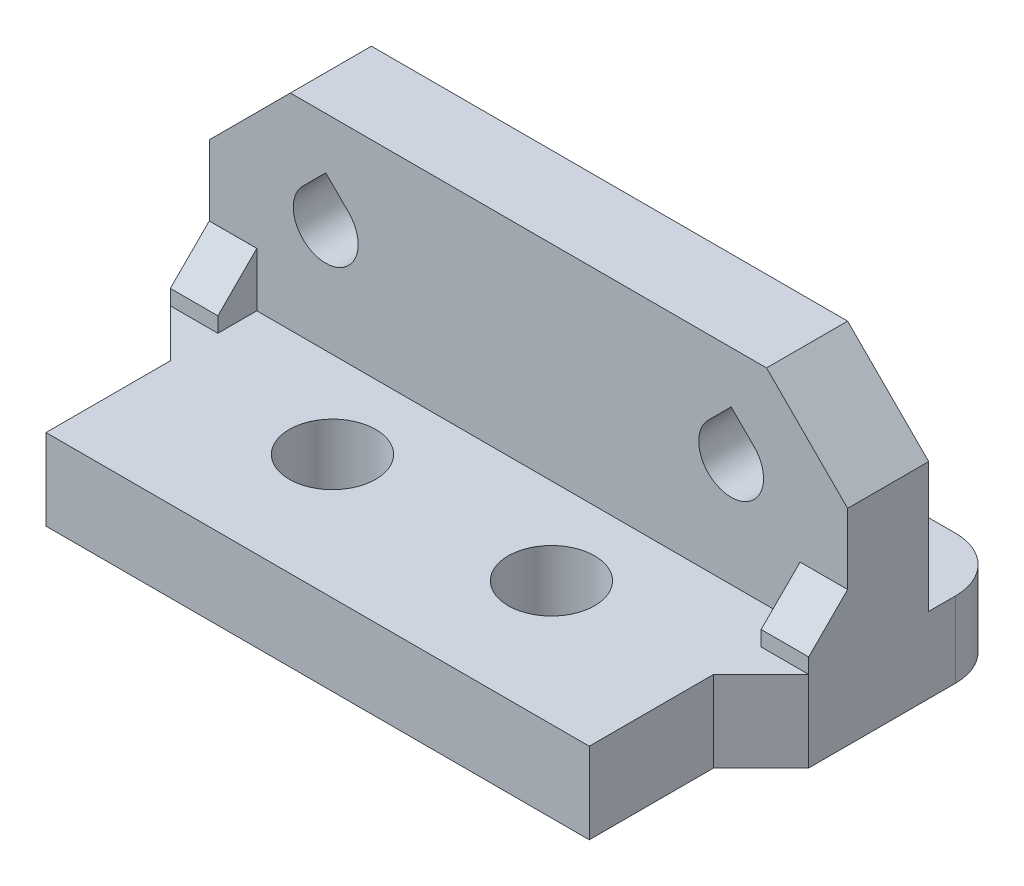
ISO-10303-21;
HEADER;
FILE_DESCRIPTION(('STEP AP214'),'2;1');
FILE_NAME('part.step','',(''),(''),'','','');
FILE_SCHEMA(('AUTOMOTIVE_DESIGN { 1 0 10303 214 1 1 1 1 }'));
ENDSEC;
DATA;
#1=APPLICATION_CONTEXT('core data for automotive mechanical design processes');
#2=APPLICATION_PROTOCOL_DEFINITION('international standard','automotive_design',2000,#1);
#3=PRODUCT_CONTEXT('',#1,'mechanical');
#4=PRODUCT('Part','Part','',(#3));
#5=PRODUCT_RELATED_PRODUCT_CATEGORY('part','',(#4));
#6=PRODUCT_DEFINITION_FORMATION('','',#4);
#7=PRODUCT_DEFINITION_CONTEXT('part definition',#1,'design');
#8=PRODUCT_DEFINITION('design','',#6,#7);
#9=PRODUCT_DEFINITION_SHAPE('','',#8);
#10=(LENGTH_UNIT() NAMED_UNIT(*) SI_UNIT(.MILLI.,.METRE.));
#11=(NAMED_UNIT(*) PLANE_ANGLE_UNIT() SI_UNIT($,.RADIAN.));
#12=(NAMED_UNIT(*) SI_UNIT($,.STERADIAN.) SOLID_ANGLE_UNIT());
#13=UNCERTAINTY_MEASURE_WITH_UNIT(LENGTH_MEASURE(1.E-05),#10,'distance_accuracy_value','');
#14=(GEOMETRIC_REPRESENTATION_CONTEXT(3) GLOBAL_UNCERTAINTY_ASSIGNED_CONTEXT((#13)) GLOBAL_UNIT_ASSIGNED_CONTEXT((#10,
#11,#12)) REPRESENTATION_CONTEXT('',''));
#15=CARTESIAN_POINT('',(0.,0.,0.));
#16=DIRECTION('',(0.,0.,1.));
#17=DIRECTION('',(1.,0.,0.));
#18=AXIS2_PLACEMENT_3D('',#15,#16,#17);
#19=CARTESIAN_POINT('',(0.,3.,0.));
#20=DIRECTION('',(0.,1.,0.));
#21=DIRECTION('',(0.,0.,1.));
#22=AXIS2_PLACEMENT_3D('',#19,#20,#21);
#23=PLANE('',#22);
#24=DIRECTION('',(0.,0.,1.));
#25=VECTOR('',#24,1.);
#26=CARTESIAN_POINT('',(10.05,3.,0.));
#27=LINE('',#26,#25);
#28=CARTESIAN_POINT('',(10.05,3.,-3.2));
#29=VERTEX_POINT('',#28);
#30=CARTESIAN_POINT('',(10.05,3.,-1.75940107675852));
#31=VERTEX_POINT('',#30);
#32=EDGE_CURVE('E280',#29,#31,#27,.T.);
#33=ORIENTED_EDGE('',*,*,#32,.F.);
#34=DIRECTION('',(1.,0.,0.));
#35=VECTOR('',#34,1.);
#36=CARTESIAN_POINT('',(0.,3.,-3.2));
#37=LINE('',#36,#35);
#38=CARTESIAN_POINT('',(-10.05,3.,-3.2));
#39=VERTEX_POINT('',#38);
#40=EDGE_CURVE('E369',#39,#29,#37,.T.);
#41=ORIENTED_EDGE('',*,*,#40,.F.);
#42=DIRECTION('',(0.,0.,1.));
#43=VECTOR('',#42,1.);
#44=CARTESIAN_POINT('',(-10.05,3.,0.));
#45=LINE('',#44,#43);
#46=CARTESIAN_POINT('',(-10.05,3.,-1.75940107675852));
#47=VERTEX_POINT('',#46);
#48=EDGE_CURVE('E300',#39,#47,#45,.T.);
#49=ORIENTED_EDGE('',*,*,#48,.T.);
#50=DIRECTION('',(-1.,0.,0.));
#51=VECTOR('',#50,1.);
#52=CARTESIAN_POINT('',(0.,3.,-1.75940107675852));
#53=LINE('',#52,#51);
#54=CARTESIAN_POINT('',(-11.8094010767585,3.,-1.75940107675852));
#55=VERTEX_POINT('',#54);
#56=EDGE_CURVE('E291',#47,#55,#53,.T.);
#57=ORIENTED_EDGE('',*,*,#56,.T.);
#58=DIRECTION('',(0.707106781186544,0.,0.707106781186551));
#59=VECTOR('',#58,1.);
#60=CARTESIAN_POINT('',(-5.02500000000006,3.,5.025));
#61=LINE('',#60,#59);
#62=CARTESIAN_POINT('',(-10.05,3.,0.));
#63=VERTEX_POINT('',#62);
#64=EDGE_CURVE('E372',#55,#63,#61,.T.);
#65=ORIENTED_EDGE('',*,*,#64,.T.);
#66=DIRECTION('',(0.,0.,-1.));
#67=VECTOR('',#66,1.);
#68=CARTESIAN_POINT('',(-10.05,3.,0.));
#69=LINE('',#68,#67);
#70=CARTESIAN_POINT('',(-10.05,3.,4.6));
#71=VERTEX_POINT('',#70);
#72=EDGE_CURVE('E375',#71,#63,#69,.T.);
#73=ORIENTED_EDGE('',*,*,#72,.F.);
#74=DIRECTION('',(1.,0.,0.));
#75=VECTOR('',#74,1.);
#76=CARTESIAN_POINT('',(0.,3.,4.6));
#77=LINE('',#76,#75);
#78=CARTESIAN_POINT('',(10.05,3.,4.6));
#79=VERTEX_POINT('',#78);
#80=EDGE_CURVE('E378',#71,#79,#77,.T.);
#81=ORIENTED_EDGE('',*,*,#80,.T.);
#82=DIRECTION('',(0.,0.,-1.));
#83=VECTOR('',#82,1.);
#84=CARTESIAN_POINT('',(10.05,3.,0.));
#85=LINE('',#84,#83);
#86=CARTESIAN_POINT('',(10.05,3.,0.));
#87=VERTEX_POINT('',#86);
#88=EDGE_CURVE('E380',#79,#87,#85,.T.);
#89=ORIENTED_EDGE('',*,*,#88,.T.);
#90=DIRECTION('',(-0.707106781186544,0.,0.707106781186551));
#91=VECTOR('',#90,1.);
#92=CARTESIAN_POINT('',(5.02500000000005,3.,5.025));
#93=LINE('',#92,#91);
#94=CARTESIAN_POINT('',(11.8094010767585,3.,-1.75940107675852));
#95=VERTEX_POINT('',#94);
#96=EDGE_CURVE('E382',#95,#87,#93,.T.);
#97=ORIENTED_EDGE('',*,*,#96,.F.);
#98=DIRECTION('',(1.,0.,0.));
#99=VECTOR('',#98,1.);
#100=CARTESIAN_POINT('',(0.,3.,-1.75940107675852));
#101=LINE('',#100,#99);
#102=EDGE_CURVE('E277',#31,#95,#101,.T.);
#103=ORIENTED_EDGE('',*,*,#102,.F.);
#104=EDGE_LOOP('',(#33,#41,#49,#57,#65,#73,#81,#89,#97,#103));
#105=FACE_BOUND('',#104,.T.);
#106=CARTESIAN_POINT('',(-4.05,3.,0.));
#107=DIRECTION('',(0.,1.,0.));
#108=DIRECTION('',(0.,0.,1.));
#109=AXIS2_PLACEMENT_3D('',#106,#107,#108);
#110=CIRCLE('',#109,1.6);
#111=CARTESIAN_POINT('',(-4.05,3.,1.6));
#112=VERTEX_POINT('',#111);
#113=EDGE_CURVE('E363',#112,#112,#110,.T.);
#114=ORIENTED_EDGE('',*,*,#113,.F.);
#115=EDGE_LOOP('',(#114));
#116=FACE_BOUND('',#115,.T.);
#117=CARTESIAN_POINT('',(4.05,3.,0.));
#118=DIRECTION('',(0.,1.,0.));
#119=DIRECTION('',(0.,0.,1.));
#120=AXIS2_PLACEMENT_3D('',#117,#118,#119);
#121=CIRCLE('',#120,1.6);
#122=CARTESIAN_POINT('',(4.05,3.,1.6));
#123=VERTEX_POINT('',#122);
#124=EDGE_CURVE('E357',#123,#123,#121,.T.);
#125=ORIENTED_EDGE('',*,*,#124,.F.);
#126=EDGE_LOOP('',(#125));
#127=FACE_BOUND('',#126,.T.);
#128=ADVANCED_FACE('F43',(#105,#116,#127),#23,.T.);
#129=CARTESIAN_POINT('',(0.,3.,-6.2));
#130=DIRECTION('',(0.,0.,-1.));
#131=DIRECTION('',(-1.,0.,0.));
#132=AXIS2_PLACEMENT_3D('',#129,#130,#131);
#133=PLANE('',#132);
#134=DIRECTION('',(1.,0.,0.));
#135=VECTOR('',#134,1.);
#136=CARTESIAN_POINT('',(0.,2.8,-6.2));
#137=LINE('',#136,#135);
#138=CARTESIAN_POINT('',(-11.8094010767585,2.8,-6.2));
#139=VERTEX_POINT('',#138);
#140=CARTESIAN_POINT('',(11.8094010767585,2.8,-6.2));
#141=VERTEX_POINT('',#140);
#142=EDGE_CURVE('E242',#139,#141,#137,.T.);
#143=ORIENTED_EDGE('',*,*,#142,.F.);
#144=DIRECTION('',(0.,-1.,0.));
#145=VECTOR('',#144,1.);
#146=CARTESIAN_POINT('',(-11.8094010767585,42.0085660040033,-6.2));
#147=LINE('',#146,#145);
#148=CARTESIAN_POINT('',(-11.8094010767585,7.6,-6.2));
#149=VERTEX_POINT('',#148);
#150=EDGE_CURVE('E247',#149,#139,#147,.T.);
#151=ORIENTED_EDGE('',*,*,#150,.F.);
#152=DIRECTION('',(-0.707106781186549,-0.707106781186546,0.));
#153=VECTOR('',#152,1.);
#154=CARTESIAN_POINT('',(-8.20470053837923,11.2047005383793,-6.2));
#155=LINE('',#154,#153);
#156=CARTESIAN_POINT('',(-8.8094010767585,10.6,-6.2));
#157=VERTEX_POINT('',#156);
#158=EDGE_CURVE('E438',#149,#157,#155,.F.);
#159=ORIENTED_EDGE('',*,*,#158,.T.);
#160=DIRECTION('',(1.,0.,0.));
#161=VECTOR('',#160,1.);
#162=CARTESIAN_POINT('',(0.,10.6,-6.2));
#163=LINE('',#162,#161);
#164=CARTESIAN_POINT('',(8.8094010767585,10.6,-6.2));
#165=VERTEX_POINT('',#164);
#166=EDGE_CURVE('E248',#157,#165,#163,.T.);
#167=ORIENTED_EDGE('',*,*,#166,.T.);
#168=DIRECTION('',(0.707106781186546,-0.707106781186549,0.));
#169=VECTOR('',#168,1.);
#170=CARTESIAN_POINT('',(8.20470053837927,11.2047005383792,-6.2));
#171=LINE('',#170,#169);
#172=CARTESIAN_POINT('',(11.8094010767585,7.59999999999999,-6.2));
#173=VERTEX_POINT('',#172);
#174=EDGE_CURVE('E245',#165,#173,#171,.T.);
#175=ORIENTED_EDGE('',*,*,#174,.T.);
#176=DIRECTION('',(0.,-1.,0.));
#177=VECTOR('',#176,1.);
#178=CARTESIAN_POINT('',(11.8094010767585,42.0085660040033,-6.2));
#179=LINE('',#178,#177);
#180=EDGE_CURVE('E237',#173,#141,#179,.T.);
#181=ORIENTED_EDGE('',*,*,#180,.T.);
#182=EDGE_LOOP('',(#143,#151,#159,#167,#175,#181));
#183=FACE_BOUND('',#182,.T.);
#184=DIRECTION('',(0.707106781186542,-0.707106781186553,0.));
#185=VECTOR('',#184,1.);
#186=CARTESIAN_POINT('',(0.598528137423805,0.598528137423795,-6.2));
#187=LINE('',#186,#185);
#188=CARTESIAN_POINT('',(-7.5,8.69705627484773,-6.2));
#189=VERTEX_POINT('',#188);
#190=CARTESIAN_POINT('',(-6.65147186257614,7.84852813742386,-6.2));
#191=VERTEX_POINT('',#190);
#192=EDGE_CURVE('E336',#189,#191,#187,.T.);
#193=ORIENTED_EDGE('',*,*,#192,.F.);
#194=DIRECTION('',(-0.707106781186542,-0.707106781186553,0.));
#195=VECTOR('',#194,1.);
#196=CARTESIAN_POINT('',(-8.09852813742393,8.09852813742379,-6.2));
#197=LINE('',#196,#195);
#198=CARTESIAN_POINT('',(-8.34852813742386,7.84852813742385,-6.2));
#199=VERTEX_POINT('',#198);
#200=EDGE_CURVE('E333',#189,#199,#197,.T.);
#201=ORIENTED_EDGE('',*,*,#200,.T.);
#202=CARTESIAN_POINT('',(-7.5,7.,-6.2));
#203=DIRECTION('',(0.,0.,-1.));
#204=DIRECTION('',(-1.,0.,0.));
#205=AXIS2_PLACEMENT_3D('',#202,#203,#204);
#206=CIRCLE('',#205,1.2);
#207=EDGE_CURVE('E303',#191,#199,#206,.T.);
#208=ORIENTED_EDGE('',*,*,#207,.F.);
#209=EDGE_LOOP('',(#193,#201,#208));
#210=FACE_BOUND('',#209,.T.);
#211=DIRECTION('',(0.707106781186543,-0.707106781186552,0.));
#212=VECTOR('',#211,1.);
#213=CARTESIAN_POINT('',(8.09852813742391,8.09852813742381,-6.2));
#214=LINE('',#213,#212);
#215=CARTESIAN_POINT('',(7.5,8.69705627484772,-6.2));
#216=VERTEX_POINT('',#215);
#217=CARTESIAN_POINT('',(8.34852813742386,7.84852813742385,-6.2));
#218=VERTEX_POINT('',#217);
#219=EDGE_CURVE('E316',#216,#218,#214,.T.);
#220=ORIENTED_EDGE('',*,*,#219,.F.);
#221=DIRECTION('',(-0.707106781186544,-0.707106781186551,0.));
#222=VECTOR('',#221,1.);
#223=CARTESIAN_POINT('',(-0.598528137423822,0.598528137423816,-6.2));
#224=LINE('',#223,#222);
#225=CARTESIAN_POINT('',(6.65147186257613,7.84852813742385,-6.2));
#226=VERTEX_POINT('',#225);
#227=EDGE_CURVE('E312',#216,#226,#224,.T.);
#228=ORIENTED_EDGE('',*,*,#227,.T.);
#229=CARTESIAN_POINT('',(7.5,7.,-6.2));
#230=DIRECTION('',(0.,0.,-1.));
#231=DIRECTION('',(-1.,0.,0.));
#232=AXIS2_PLACEMENT_3D('',#229,#230,#231);
#233=CIRCLE('',#232,1.2);
#234=EDGE_CURVE('E309',#218,#226,#233,.T.);
#235=ORIENTED_EDGE('',*,*,#234,.F.);
#236=EDGE_LOOP('',(#220,#228,#235));
#237=FACE_BOUND('',#236,.T.);
#238=ADVANCED_FACE('F239',(#183,#210,#237),#133,.T.);
#239=CARTESIAN_POINT('',(0.,42.0085660040033,-3.2));
#240=DIRECTION('',(0.,0.,-1.));
#241=DIRECTION('',(-1.,0.,0.));
#242=AXIS2_PLACEMENT_3D('',#239,#240,#241);
#243=PLANE('',#242);
#244=DIRECTION('',(0.707106781186542,0.707106781186553,0.));
#245=VECTOR('',#244,1.);
#246=CARTESIAN_POINT('',(-8.09852813742393,8.09852813742379,-3.2));
#247=LINE('',#246,#245);
#248=CARTESIAN_POINT('',(-8.34852813742386,7.84852813742386,-3.2));
#249=VERTEX_POINT('',#248);
#250=CARTESIAN_POINT('',(-7.5,8.69705627484773,-3.2));
#251=VERTEX_POINT('',#250);
#252=EDGE_CURVE('E329',#249,#251,#247,.T.);
#253=ORIENTED_EDGE('',*,*,#252,.T.);
#254=DIRECTION('',(-0.707106781186542,0.707106781186553,0.));
#255=VECTOR('',#254,1.);
#256=CARTESIAN_POINT('',(0.598528137423805,0.598528137423795,-3.2));
#257=LINE('',#256,#255);
#258=CARTESIAN_POINT('',(-6.65147186257614,7.84852813742385,-3.2));
#259=VERTEX_POINT('',#258);
#260=EDGE_CURVE('E327',#259,#251,#257,.T.);
#261=ORIENTED_EDGE('',*,*,#260,.F.);
#262=CARTESIAN_POINT('',(-7.5,7.,-3.2));
#263=DIRECTION('',(0.,0.,-1.));
#264=DIRECTION('',(-1.,0.,0.));
#265=AXIS2_PLACEMENT_3D('',#262,#263,#264);
#266=CIRCLE('',#265,1.2);
#267=EDGE_CURVE('E313',#249,#259,#266,.F.);
#268=ORIENTED_EDGE('',*,*,#267,.F.);
#269=EDGE_LOOP('',(#253,#261,#268));
#270=FACE_BOUND('',#269,.T.);
#271=DIRECTION('',(0.,-1.,0.));
#272=VECTOR('',#271,1.);
#273=CARTESIAN_POINT('',(11.8094010767585,42.0085660040033,-3.2));
#274=LINE('',#273,#272);
#275=CARTESIAN_POINT('',(11.8094010767585,7.59999999999999,-3.2));
#276=VERTEX_POINT('',#275);
#277=CARTESIAN_POINT('',(11.8094010767585,5.,-3.2));
#278=VERTEX_POINT('',#277);
#279=EDGE_CURVE('E351',#276,#278,#274,.T.);
#280=ORIENTED_EDGE('',*,*,#279,.F.);
#281=DIRECTION('',(-0.707106781186546,0.707106781186549,0.));
#282=VECTOR('',#281,1.);
#283=CARTESIAN_POINT('',(8.8094010767585,10.6,-3.2));
#284=LINE('',#283,#282);
#285=CARTESIAN_POINT('',(8.8094010767585,10.6,-3.2));
#286=VERTEX_POINT('',#285);
#287=EDGE_CURVE('E445',#276,#286,#284,.T.);
#288=ORIENTED_EDGE('',*,*,#287,.T.);
#289=DIRECTION('',(1.,0.,0.));
#290=VECTOR('',#289,1.);
#291=CARTESIAN_POINT('',(0.,10.6,-3.2));
#292=LINE('',#291,#290);
#293=CARTESIAN_POINT('',(-8.8094010767585,10.6,-3.2));
#294=VERTEX_POINT('',#293);
#295=EDGE_CURVE('E347',#294,#286,#292,.T.);
#296=ORIENTED_EDGE('',*,*,#295,.F.);
#297=DIRECTION('',(0.707106781186549,0.707106781186546,0.));
#298=VECTOR('',#297,1.);
#299=CARTESIAN_POINT('',(-11.8094010767585,7.6,-3.2));
#300=LINE('',#299,#298);
#301=CARTESIAN_POINT('',(-11.8094010767585,7.6,-3.2));
#302=VERTEX_POINT('',#301);
#303=EDGE_CURVE('E443',#294,#302,#300,.F.);
#304=ORIENTED_EDGE('',*,*,#303,.T.);
#305=DIRECTION('',(0.,-1.,0.));
#306=VECTOR('',#305,1.);
#307=CARTESIAN_POINT('',(-11.8094010767585,42.0085660040033,-3.2));
#308=LINE('',#307,#306);
#309=CARTESIAN_POINT('',(-11.8094010767585,5.,-3.2));
#310=VERTEX_POINT('',#309);
#311=EDGE_CURVE('E354',#302,#310,#308,.T.);
#312=ORIENTED_EDGE('',*,*,#311,.T.);
#313=DIRECTION('',(1.,0.,0.));
#314=VECTOR('',#313,1.);
#315=CARTESIAN_POINT('',(0.,5.,-3.2));
#316=LINE('',#315,#314);
#317=CARTESIAN_POINT('',(-10.05,5.,-3.2));
#318=VERTEX_POINT('',#317);
#319=EDGE_CURVE('E284',#310,#318,#316,.T.);
#320=ORIENTED_EDGE('',*,*,#319,.T.);
#321=DIRECTION('',(0.,-1.,0.));
#322=VECTOR('',#321,1.);
#323=CARTESIAN_POINT('',(-10.05,9.27394314056959,-3.2));
#324=LINE('',#323,#322);
#325=EDGE_CURVE('E287',#318,#39,#324,.T.);
#326=ORIENTED_EDGE('',*,*,#325,.T.);
#327=ORIENTED_EDGE('',*,*,#40,.T.);
#328=DIRECTION('',(0.,-1.,0.));
#329=VECTOR('',#328,1.);
#330=CARTESIAN_POINT('',(10.05,9.27394314056959,-3.2));
#331=LINE('',#330,#329);
#332=CARTESIAN_POINT('',(10.05,5.,-3.2));
#333=VERTEX_POINT('',#332);
#334=EDGE_CURVE('E267',#333,#29,#331,.T.);
#335=ORIENTED_EDGE('',*,*,#334,.F.);
#336=DIRECTION('',(1.,0.,0.));
#337=VECTOR('',#336,1.);
#338=CARTESIAN_POINT('',(0.,5.,-3.2));
#339=LINE('',#338,#337);
#340=EDGE_CURVE('E269',#333,#278,#339,.T.);
#341=ORIENTED_EDGE('',*,*,#340,.T.);
#342=EDGE_LOOP('',(#280,#288,#296,#304,#312,#320,#326,#327,#335,#341));
#343=FACE_BOUND('',#342,.T.);
#344=DIRECTION('',(0.707106781186544,0.707106781186551,0.));
#345=VECTOR('',#344,1.);
#346=CARTESIAN_POINT('',(-0.598528137423822,0.598528137423816,-3.2));
#347=LINE('',#346,#345);
#348=CARTESIAN_POINT('',(6.65147186257613,7.84852813742385,-3.2));
#349=VERTEX_POINT('',#348);
#350=CARTESIAN_POINT('',(7.5,8.69705627484772,-3.2));
#351=VERTEX_POINT('',#350);
#352=EDGE_CURVE('E307',#349,#351,#347,.T.);
#353=ORIENTED_EDGE('',*,*,#352,.T.);
#354=DIRECTION('',(-0.707106781186543,0.707106781186552,0.));
#355=VECTOR('',#354,1.);
#356=CARTESIAN_POINT('',(8.09852813742391,8.09852813742381,-3.2));
#357=LINE('',#356,#355);
#358=CARTESIAN_POINT('',(8.34852813742386,7.84852813742385,-3.2));
#359=VERTEX_POINT('',#358);
#360=EDGE_CURVE('E304',#359,#351,#357,.T.);
#361=ORIENTED_EDGE('',*,*,#360,.F.);
#362=CARTESIAN_POINT('',(7.5,7.,-3.2));
#363=DIRECTION('',(0.,0.,-1.));
#364=DIRECTION('',(-1.,0.,0.));
#365=AXIS2_PLACEMENT_3D('',#362,#363,#364);
#366=CIRCLE('',#365,1.2);
#367=EDGE_CURVE('E306',#349,#359,#366,.F.);
#368=ORIENTED_EDGE('',*,*,#367,.F.);
#369=EDGE_LOOP('',(#353,#361,#368));
#370=FACE_BOUND('',#369,.T.);
#371=ADVANCED_FACE('F517',(#270,#343,#370),#243,.F.);
#372=CARTESIAN_POINT('',(-11.8094010767585,3.,0.));
#373=DIRECTION('',(-1.,0.,0.));
#374=DIRECTION('',(0.,0.,1.));
#375=AXIS2_PLACEMENT_3D('',#372,#373,#374);
#376=PLANE('',#375);
#377=DIRECTION('',(0.,0.,-1.));
#378=VECTOR('',#377,1.);
#379=CARTESIAN_POINT('',(-11.8094010767585,2.8,0.));
#380=LINE('',#379,#378);
#381=CARTESIAN_POINT('',(-11.8094010767585,2.8,-7.2));
#382=VERTEX_POINT('',#381);
#383=EDGE_CURVE('E253',#139,#382,#380,.T.);
#384=ORIENTED_EDGE('',*,*,#383,.T.);
#385=DIRECTION('',(0.,-1.,0.));
#386=VECTOR('',#385,1.);
#387=CARTESIAN_POINT('',(-11.8094010767585,3.,-7.2));
#388=LINE('',#387,#386);
#389=CARTESIAN_POINT('',(-11.8094010767585,0.,-7.2));
#390=VERTEX_POINT('',#389);
#391=EDGE_CURVE('E12',#382,#390,#388,.T.);
#392=ORIENTED_EDGE('',*,*,#391,.T.);
#393=DIRECTION('',(0.,0.,-1.));
#394=VECTOR('',#393,1.);
#395=CARTESIAN_POINT('',(-11.8094010767585,0.,0.));
#396=LINE('',#395,#394);
#397=CARTESIAN_POINT('',(-11.8094010767585,0.,-1.75940107675852));
#398=VERTEX_POINT('',#397);
#399=EDGE_CURVE('E366',#398,#390,#396,.T.);
#400=ORIENTED_EDGE('',*,*,#399,.F.);
#401=DIRECTION('',(0.,-1.,0.));
#402=VECTOR('',#401,1.);
#403=CARTESIAN_POINT('',(-11.8094010767585,3.,-1.75940107675852));
#404=LINE('',#403,#402);
#405=EDGE_CURVE('E413',#55,#398,#404,.T.);
#406=ORIENTED_EDGE('',*,*,#405,.F.);
#407=DIRECTION('',(0.,-1.,0.));
#408=VECTOR('',#407,1.);
#409=CARTESIAN_POINT('',(-11.8094010767585,9.27394314056959,-1.75940107675852));
#410=LINE('',#409,#408);
#411=CARTESIAN_POINT('',(-11.8094010767585,3.55999999999999,-1.75940107675852));
#412=VERTEX_POINT('',#411);
#413=EDGE_CURVE('E292',#412,#55,#410,.T.);
#414=ORIENTED_EDGE('',*,*,#413,.F.);
#415=DIRECTION('',(0.,0.707106781186549,-0.707106781186546));
#416=VECTOR('',#415,1.);
#417=CARTESIAN_POINT('',(-11.8094010767585,2.40029946162073,-0.59970053837927));
#418=LINE('',#417,#416);
#419=CARTESIAN_POINT('',(-11.8094010767585,5.,-3.19940107675853));
#420=VERTEX_POINT('',#419);
#421=EDGE_CURVE('E431',#412,#420,#418,.T.);
#422=ORIENTED_EDGE('',*,*,#421,.T.);
#423=DIRECTION('',(0.,0.,-1.));
#424=VECTOR('',#423,1.);
#425=CARTESIAN_POINT('',(-11.8094010767585,5.,0.));
#426=LINE('',#425,#424);
#427=EDGE_CURVE('E288',#420,#310,#426,.T.);
#428=ORIENTED_EDGE('',*,*,#427,.T.);
#429=ORIENTED_EDGE('',*,*,#311,.F.);
#430=DIRECTION('',(0.,0.,-1.));
#431=VECTOR('',#430,1.);
#432=CARTESIAN_POINT('',(-11.8094010767585,7.6,0.));
#433=LINE('',#432,#431);
#434=EDGE_CURVE('E447',#302,#149,#433,.T.);
#435=ORIENTED_EDGE('',*,*,#434,.T.);
#436=ORIENTED_EDGE('',*,*,#150,.T.);
#437=EDGE_LOOP('',(#384,#392,#400,#406,#414,#422,#428,#429,#435,#436));
#438=FACE_BOUND('',#437,.T.);
#439=ADVANCED_FACE('F504',(#438),#376,.T.);
#440=CARTESIAN_POINT('',(-5.02500000000006,3.,5.025));
#441=DIRECTION('',(0.707106781186551,0.,-0.707106781186544));
#442=DIRECTION('',(-0.707106781186544,0.,-0.707106781186551));
#443=AXIS2_PLACEMENT_3D('',#440,#441,#442);
#444=PLANE('',#443);
#445=DIRECTION('',(0.707106781186544,0.,0.707106781186551));
#446=VECTOR('',#445,1.);
#447=CARTESIAN_POINT('',(-5.02500000000006,0.,5.025));
#448=LINE('',#447,#446);
#449=CARTESIAN_POINT('',(-10.05,0.,0.));
#450=VERTEX_POINT('',#449);
#451=EDGE_CURVE('E388',#398,#450,#448,.T.);
#452=ORIENTED_EDGE('',*,*,#451,.T.);
#453=DIRECTION('',(0.,-1.,0.));
#454=VECTOR('',#453,1.);
#455=CARTESIAN_POINT('',(-10.05,3.,0.));
#456=LINE('',#455,#454);
#457=EDGE_CURVE('E411',#63,#450,#456,.T.);
#458=ORIENTED_EDGE('',*,*,#457,.F.);
#459=ORIENTED_EDGE('',*,*,#64,.F.);
#460=ORIENTED_EDGE('',*,*,#405,.T.);
#461=EDGE_LOOP('',(#452,#458,#459,#460));
#462=FACE_BOUND('',#461,.T.);
#463=ADVANCED_FACE('F500',(#462),#444,.F.);
#464=CARTESIAN_POINT('',(-10.05,3.,0.));
#465=DIRECTION('',(-1.,0.,0.));
#466=DIRECTION('',(0.,0.,1.));
#467=AXIS2_PLACEMENT_3D('',#464,#465,#466);
#468=PLANE('',#467);
#469=DIRECTION('',(0.,0.,-1.));
#470=VECTOR('',#469,1.);
#471=CARTESIAN_POINT('',(-10.05,0.,0.));
#472=LINE('',#471,#470);
#473=CARTESIAN_POINT('',(-10.05,0.,4.6));
#474=VERTEX_POINT('',#473);
#475=EDGE_CURVE('E391',#474,#450,#472,.T.);
#476=ORIENTED_EDGE('',*,*,#475,.F.);
#477=DIRECTION('',(0.,-1.,0.));
#478=VECTOR('',#477,1.);
#479=CARTESIAN_POINT('',(-10.05,3.,4.6));
#480=LINE('',#479,#478);
#481=EDGE_CURVE('E409',#71,#474,#480,.T.);
#482=ORIENTED_EDGE('',*,*,#481,.F.);
#483=ORIENTED_EDGE('',*,*,#72,.T.);
#484=ORIENTED_EDGE('',*,*,#457,.T.);
#485=EDGE_LOOP('',(#476,#482,#483,#484));
#486=FACE_BOUND('',#485,.T.);
#487=ADVANCED_FACE('F496',(#486),#468,.T.);
#488=CARTESIAN_POINT('',(0.,3.,4.6));
#489=DIRECTION('',(0.,0.,-1.));
#490=DIRECTION('',(-1.,0.,0.));
#491=AXIS2_PLACEMENT_3D('',#488,#489,#490);
#492=PLANE('',#491);
#493=DIRECTION('',(1.,0.,0.));
#494=VECTOR('',#493,1.);
#495=CARTESIAN_POINT('',(0.,0.,4.6));
#496=LINE('',#495,#494);
#497=CARTESIAN_POINT('',(10.05,0.,4.6));
#498=VERTEX_POINT('',#497);
#499=EDGE_CURVE('E394',#474,#498,#496,.T.);
#500=ORIENTED_EDGE('',*,*,#499,.T.);
#501=DIRECTION('',(0.,-1.,0.));
#502=VECTOR('',#501,1.);
#503=CARTESIAN_POINT('',(10.05,3.,4.6));
#504=LINE('',#503,#502);
#505=EDGE_CURVE('E406',#79,#498,#504,.T.);
#506=ORIENTED_EDGE('',*,*,#505,.F.);
#507=ORIENTED_EDGE('',*,*,#80,.F.);
#508=ORIENTED_EDGE('',*,*,#481,.T.);
#509=EDGE_LOOP('',(#500,#506,#507,#508));
#510=FACE_BOUND('',#509,.T.);
#511=ADVANCED_FACE('F531',(#510),#492,.F.);
#512=CARTESIAN_POINT('',(10.05,3.,0.));
#513=DIRECTION('',(-1.,0.,0.));
#514=DIRECTION('',(0.,0.,1.));
#515=AXIS2_PLACEMENT_3D('',#512,#513,#514);
#516=PLANE('',#515);
#517=DIRECTION('',(0.,0.,-1.));
#518=VECTOR('',#517,1.);
#519=CARTESIAN_POINT('',(10.05,0.,0.));
#520=LINE('',#519,#518);
#521=CARTESIAN_POINT('',(10.05,0.,0.));
#522=VERTEX_POINT('',#521);
#523=EDGE_CURVE('E396',#498,#522,#520,.T.);
#524=ORIENTED_EDGE('',*,*,#523,.T.);
#525=DIRECTION('',(0.,-1.,0.));
#526=VECTOR('',#525,1.);
#527=CARTESIAN_POINT('',(10.05,3.,0.));
#528=LINE('',#527,#526);
#529=EDGE_CURVE('E404',#87,#522,#528,.T.);
#530=ORIENTED_EDGE('',*,*,#529,.F.);
#531=ORIENTED_EDGE('',*,*,#88,.F.);
#532=ORIENTED_EDGE('',*,*,#505,.T.);
#533=EDGE_LOOP('',(#524,#530,#531,#532));
#534=FACE_BOUND('',#533,.T.);
#535=ADVANCED_FACE('F489',(#534),#516,.F.);
#536=CARTESIAN_POINT('',(5.02500000000005,3.,5.025));
#537=DIRECTION('',(0.707106781186551,0.,0.707106781186544));
#538=DIRECTION('',(0.707106781186544,0.,-0.707106781186551));
#539=AXIS2_PLACEMENT_3D('',#536,#537,#538);
#540=PLANE('',#539);
#541=DIRECTION('',(-0.707106781186544,0.,0.707106781186551));
#542=VECTOR('',#541,1.);
#543=CARTESIAN_POINT('',(5.02500000000005,0.,5.025));
#544=LINE('',#543,#542);
#545=CARTESIAN_POINT('',(11.8094010767585,0.,-1.75940107675852));
#546=VERTEX_POINT('',#545);
#547=EDGE_CURVE('E399',#546,#522,#544,.T.);
#548=ORIENTED_EDGE('',*,*,#547,.F.);
#549=DIRECTION('',(0.,-1.,0.));
#550=VECTOR('',#549,1.);
#551=CARTESIAN_POINT('',(11.8094010767585,3.,-1.75940107675852));
#552=LINE('',#551,#550);
#553=EDGE_CURVE('E385',#95,#546,#552,.T.);
#554=ORIENTED_EDGE('',*,*,#553,.F.);
#555=ORIENTED_EDGE('',*,*,#96,.T.);
#556=ORIENTED_EDGE('',*,*,#529,.T.);
#557=EDGE_LOOP('',(#548,#554,#555,#556));
#558=FACE_BOUND('',#557,.T.);
#559=ADVANCED_FACE('F478',(#558),#540,.T.);
#560=CARTESIAN_POINT('',(11.8094010767585,3.,0.));
#561=DIRECTION('',(-1.,0.,0.));
#562=DIRECTION('',(0.,0.,1.));
#563=AXIS2_PLACEMENT_3D('',#560,#561,#562);
#564=PLANE('',#563);
#565=DIRECTION('',(0.,0.,-1.));
#566=VECTOR('',#565,1.);
#567=CARTESIAN_POINT('',(11.8094010767585,0.,0.));
#568=LINE('',#567,#566);
#569=CARTESIAN_POINT('',(11.8094010767585,0.,-7.2));
#570=VERTEX_POINT('',#569);
#571=EDGE_CURVE('E373',#546,#570,#568,.T.);
#572=ORIENTED_EDGE('',*,*,#571,.T.);
#573=DIRECTION('',(0.,-1.,0.));
#574=VECTOR('',#573,1.);
#575=CARTESIAN_POINT('',(11.8094010767585,2.8,-7.2));
#576=LINE('',#575,#574);
#577=CARTESIAN_POINT('',(11.8094010767585,2.8,-7.2));
#578=VERTEX_POINT('',#577);
#579=EDGE_CURVE('E66',#570,#578,#576,.F.);
#580=ORIENTED_EDGE('',*,*,#579,.T.);
#581=DIRECTION('',(0.,0.,-1.));
#582=VECTOR('',#581,1.);
#583=CARTESIAN_POINT('',(11.8094010767585,2.8,0.));
#584=LINE('',#583,#582);
#585=EDGE_CURVE('E251',#141,#578,#584,.T.);
#586=ORIENTED_EDGE('',*,*,#585,.F.);
#587=ORIENTED_EDGE('',*,*,#180,.F.);
#588=DIRECTION('',(0.,0.,1.));
#589=VECTOR('',#588,1.);
#590=CARTESIAN_POINT('',(11.8094010767585,7.59999999999999,-3.2));
#591=LINE('',#590,#589);
#592=EDGE_CURVE('E441',#173,#276,#591,.T.);
#593=ORIENTED_EDGE('',*,*,#592,.T.);
#594=ORIENTED_EDGE('',*,*,#279,.T.);
#595=DIRECTION('',(0.,0.,-1.));
#596=VECTOR('',#595,1.);
#597=CARTESIAN_POINT('',(11.8094010767585,5.,0.));
#598=LINE('',#597,#596);
#599=CARTESIAN_POINT('',(11.8094010767585,5.,-3.19940107675853));
#600=VERTEX_POINT('',#599);
#601=EDGE_CURVE('E256',#600,#278,#598,.T.);
#602=ORIENTED_EDGE('',*,*,#601,.F.);
#603=DIRECTION('',(0.,0.707106781186546,-0.707106781186549));
#604=VECTOR('',#603,1.);
#605=CARTESIAN_POINT('',(11.8094010767585,3.56,-1.75940107675852));
#606=LINE('',#605,#604);
#607=CARTESIAN_POINT('',(11.8094010767585,3.56,-1.75940107675852));
#608=VERTEX_POINT('',#607);
#609=EDGE_CURVE('E422',#600,#608,#606,.F.);
#610=ORIENTED_EDGE('',*,*,#609,.T.);
#611=DIRECTION('',(0.,-1.,0.));
#612=VECTOR('',#611,1.);
#613=CARTESIAN_POINT('',(11.8094010767585,9.27394314056959,-1.75940107675852));
#614=LINE('',#613,#612);
#615=EDGE_CURVE('E272',#608,#95,#614,.T.);
#616=ORIENTED_EDGE('',*,*,#615,.T.);
#617=ORIENTED_EDGE('',*,*,#553,.T.);
#618=EDGE_LOOP('',(#572,#580,#586,#587,#593,#594,#602,#610,#616,#617));
#619=FACE_BOUND('',#618,.T.);
#620=ADVANCED_FACE('F255',(#619),#564,.F.);
#621=CARTESIAN_POINT('',(0.,0.,0.));
#622=DIRECTION('',(0.,1.,0.));
#623=DIRECTION('',(0.,0.,1.));
#624=AXIS2_PLACEMENT_3D('',#621,#622,#623);
#625=PLANE('',#624);
#626=DIRECTION('',(1.,0.,0.));
#627=VECTOR('',#626,1.);
#628=CARTESIAN_POINT('',(0.,0.,-9.2));
#629=LINE('',#628,#627);
#630=CARTESIAN_POINT('',(-9.8094010767585,0.,-9.2));
#631=VERTEX_POINT('',#630);
#632=CARTESIAN_POINT('',(9.8094010767585,0.,-9.2));
#633=VERTEX_POINT('',#632);
#634=EDGE_CURVE('E263',#631,#633,#629,.T.);
#635=ORIENTED_EDGE('',*,*,#634,.T.);
#636=CARTESIAN_POINT('',(9.8094010767585,0.,-7.2));
#637=DIRECTION('',(0.,1.,0.));
#638=DIRECTION('',(0.,0.,1.));
#639=AXIS2_PLACEMENT_3D('',#636,#637,#638);
#640=CIRCLE('',#639,2.);
#641=EDGE_CURVE('E457',#633,#570,#640,.F.);
#642=ORIENTED_EDGE('',*,*,#641,.T.);
#643=ORIENTED_EDGE('',*,*,#571,.F.);
#644=ORIENTED_EDGE('',*,*,#547,.T.);
#645=ORIENTED_EDGE('',*,*,#523,.F.);
#646=ORIENTED_EDGE('',*,*,#499,.F.);
#647=ORIENTED_EDGE('',*,*,#475,.T.);
#648=ORIENTED_EDGE('',*,*,#451,.F.);
#649=ORIENTED_EDGE('',*,*,#399,.T.);
#650=CARTESIAN_POINT('',(-9.8094010767585,0.,-7.2));
#651=DIRECTION('',(0.,1.,0.));
#652=DIRECTION('',(0.,0.,1.));
#653=AXIS2_PLACEMENT_3D('',#650,#651,#652);
#654=CIRCLE('',#653,2.);
#655=EDGE_CURVE('E455',#390,#631,#654,.F.);
#656=ORIENTED_EDGE('',*,*,#655,.T.);
#657=EDGE_LOOP('',(#635,#642,#643,#644,#645,#646,#647,#648,#649,#656));
#658=FACE_BOUND('',#657,.T.);
#659=CARTESIAN_POINT('',(4.05,0.,0.));
#660=DIRECTION('',(0.,1.,0.));
#661=DIRECTION('',(0.,0.,1.));
#662=AXIS2_PLACEMENT_3D('',#659,#660,#661);
#663=CIRCLE('',#662,1.6);
#664=CARTESIAN_POINT('',(4.05,0.,1.6));
#665=VERTEX_POINT('',#664);
#666=EDGE_CURVE('E350',#665,#665,#663,.T.);
#667=ORIENTED_EDGE('',*,*,#666,.T.);
#668=EDGE_LOOP('',(#667));
#669=FACE_BOUND('',#668,.T.);
#670=CARTESIAN_POINT('',(-4.05,0.,0.));
#671=DIRECTION('',(0.,1.,0.));
#672=DIRECTION('',(0.,0.,1.));
#673=AXIS2_PLACEMENT_3D('',#670,#671,#672);
#674=CIRCLE('',#673,1.6);
#675=CARTESIAN_POINT('',(-4.05,0.,1.6));
#676=VERTEX_POINT('',#675);
#677=EDGE_CURVE('E360',#676,#676,#674,.T.);
#678=ORIENTED_EDGE('',*,*,#677,.T.);
#679=EDGE_LOOP('',(#678));
#680=FACE_BOUND('',#679,.T.);
#681=ADVANCED_FACE('F471',(#658,#669,#680),#625,.F.);
#682=CARTESIAN_POINT('',(-4.05,3.,0.));
#683=DIRECTION('',(0.,-1.,0.));
#684=DIRECTION('',(0.,0.,-1.));
#685=AXIS2_PLACEMENT_3D('',#682,#683,#684);
#686=CYLINDRICAL_SURFACE('',#685,1.6);
#687=ORIENTED_EDGE('',*,*,#113,.T.);
#688=EDGE_LOOP('',(#687));
#689=FACE_BOUND('',#688,.T.);
#690=ORIENTED_EDGE('',*,*,#677,.F.);
#691=EDGE_LOOP('',(#690));
#692=FACE_BOUND('',#691,.T.);
#693=ADVANCED_FACE('F521',(#689,#692),#686,.F.);
#694=CARTESIAN_POINT('',(4.05,3.,0.));
#695=DIRECTION('',(0.,-1.,0.));
#696=DIRECTION('',(0.,0.,-1.));
#697=AXIS2_PLACEMENT_3D('',#694,#695,#696);
#698=CYLINDRICAL_SURFACE('',#697,1.6);
#699=ORIENTED_EDGE('',*,*,#124,.T.);
#700=EDGE_LOOP('',(#699));
#701=FACE_BOUND('',#700,.T.);
#702=ORIENTED_EDGE('',*,*,#666,.F.);
#703=EDGE_LOOP('',(#702));
#704=FACE_BOUND('',#703,.T.);
#705=ADVANCED_FACE('F642',(#701,#704),#698,.F.);
#706=CARTESIAN_POINT('',(0.,10.6,0.));
#707=DIRECTION('',(0.,1.,0.));
#708=DIRECTION('',(0.,0.,1.));
#709=AXIS2_PLACEMENT_3D('',#706,#707,#708);
#710=PLANE('',#709);
#711=ORIENTED_EDGE('',*,*,#295,.T.);
#712=DIRECTION('',(0.,0.,-1.));
#713=VECTOR('',#712,1.);
#714=CARTESIAN_POINT('',(8.8094010767585,10.6,-6.2));
#715=LINE('',#714,#713);
#716=EDGE_CURVE('E435',#286,#165,#715,.T.);
#717=ORIENTED_EDGE('',*,*,#716,.T.);
#718=ORIENTED_EDGE('',*,*,#166,.F.);
#719=DIRECTION('',(0.,0.,1.));
#720=VECTOR('',#719,1.);
#721=CARTESIAN_POINT('',(-8.8094010767585,10.6,0.));
#722=LINE('',#721,#720);
#723=EDGE_CURVE('E433',#157,#294,#722,.T.);
#724=ORIENTED_EDGE('',*,*,#723,.T.);
#725=EDGE_LOOP('',(#711,#717,#718,#724));
#726=FACE_BOUND('',#725,.T.);
#727=ADVANCED_FACE('F633',(#726),#710,.T.);
#728=CARTESIAN_POINT('',(-8.09852813742393,8.09852813742379,0.562038683963073));
#729=DIRECTION('',(0.707106781186553,-0.707106781186542,0.));
#730=DIRECTION('',(0.707106781186542,0.707106781186553,0.));
#731=AXIS2_PLACEMENT_3D('',#728,#729,#730);
#732=PLANE('',#731);
#733=DIRECTION('',(0.,0.,-1.));
#734=VECTOR('',#733,1.);
#735=CARTESIAN_POINT('',(-8.34852813742386,7.84852813742385,0.562038683963073));
#736=LINE('',#735,#734);
#737=EDGE_CURVE('E338',#249,#199,#736,.T.);
#738=ORIENTED_EDGE('',*,*,#737,.T.);
#739=ORIENTED_EDGE('',*,*,#200,.F.);
#740=DIRECTION('',(0.,0.,-1.));
#741=VECTOR('',#740,1.);
#742=CARTESIAN_POINT('',(-7.5,8.69705627484773,0.562038683963073));
#743=LINE('',#742,#741);
#744=EDGE_CURVE('E342',#251,#189,#743,.T.);
#745=ORIENTED_EDGE('',*,*,#744,.F.);
#746=ORIENTED_EDGE('',*,*,#252,.F.);
#747=EDGE_LOOP('',(#738,#739,#745,#746));
#748=FACE_BOUND('',#747,.T.);
#749=ADVANCED_FACE('F629',(#748),#732,.T.);
#750=CARTESIAN_POINT('',(0.598528137423805,0.598528137423795,0.562038683963073));
#751=DIRECTION('',(0.707106781186553,0.707106781186542,0.));
#752=DIRECTION('',(-0.707106781186542,0.707106781186553,0.));
#753=AXIS2_PLACEMENT_3D('',#750,#751,#752);
#754=PLANE('',#753);
#755=ORIENTED_EDGE('',*,*,#260,.T.);
#756=ORIENTED_EDGE('',*,*,#744,.T.);
#757=ORIENTED_EDGE('',*,*,#192,.T.);
#758=DIRECTION('',(0.,0.,-1.));
#759=VECTOR('',#758,1.);
#760=CARTESIAN_POINT('',(-6.65147186257614,7.84852813742386,0.562038683963073));
#761=LINE('',#760,#759);
#762=EDGE_CURVE('E339',#259,#191,#761,.T.);
#763=ORIENTED_EDGE('',*,*,#762,.F.);
#764=EDGE_LOOP('',(#755,#756,#757,#763));
#765=FACE_BOUND('',#764,.T.);
#766=ADVANCED_FACE('F626',(#765),#754,.F.);
#767=CARTESIAN_POINT('',(-7.5,7.,0.562038683963073));
#768=DIRECTION('',(0.,0.,-1.));
#769=DIRECTION('',(-1.,0.,0.));
#770=AXIS2_PLACEMENT_3D('',#767,#768,#769);
#771=CYLINDRICAL_SURFACE('',#770,1.2);
#772=ORIENTED_EDGE('',*,*,#267,.T.);
#773=ORIENTED_EDGE('',*,*,#762,.T.);
#774=ORIENTED_EDGE('',*,*,#207,.T.);
#775=ORIENTED_EDGE('',*,*,#737,.F.);
#776=EDGE_LOOP('',(#772,#773,#774,#775));
#777=FACE_BOUND('',#776,.T.);
#778=ADVANCED_FACE('F621',(#777),#771,.F.);
#779=CARTESIAN_POINT('',(-0.598528137423822,0.598528137423816,0.562038683963073));
#780=DIRECTION('',(0.707106781186551,-0.707106781186544,0.));
#781=DIRECTION('',(0.707106781186544,0.707106781186551,0.));
#782=AXIS2_PLACEMENT_3D('',#779,#780,#781);
#783=PLANE('',#782);
#784=DIRECTION('',(0.,0.,-1.));
#785=VECTOR('',#784,1.);
#786=CARTESIAN_POINT('',(6.65147186257613,7.84852813742385,0.562038683963073));
#787=LINE('',#786,#785);
#788=EDGE_CURVE('E318',#349,#226,#787,.T.);
#789=ORIENTED_EDGE('',*,*,#788,.T.);
#790=ORIENTED_EDGE('',*,*,#227,.F.);
#791=DIRECTION('',(0.,0.,-1.));
#792=VECTOR('',#791,1.);
#793=CARTESIAN_POINT('',(7.5,8.69705627484772,0.562038683963073));
#794=LINE('',#793,#792);
#795=EDGE_CURVE('E322',#351,#216,#794,.T.);
#796=ORIENTED_EDGE('',*,*,#795,.F.);
#797=ORIENTED_EDGE('',*,*,#352,.F.);
#798=EDGE_LOOP('',(#789,#790,#796,#797));
#799=FACE_BOUND('',#798,.T.);
#800=ADVANCED_FACE('F617',(#799),#783,.T.);
#801=CARTESIAN_POINT('',(8.09852813742391,8.09852813742381,0.562038683963073));
#802=DIRECTION('',(0.707106781186552,0.707106781186543,0.));
#803=DIRECTION('',(-0.707106781186543,0.707106781186552,0.));
#804=AXIS2_PLACEMENT_3D('',#801,#802,#803);
#805=PLANE('',#804);
#806=ORIENTED_EDGE('',*,*,#360,.T.);
#807=ORIENTED_EDGE('',*,*,#795,.T.);
#808=ORIENTED_EDGE('',*,*,#219,.T.);
#809=DIRECTION('',(0.,0.,-1.));
#810=VECTOR('',#809,1.);
#811=CARTESIAN_POINT('',(8.34852813742386,7.84852813742385,0.562038683963073));
#812=LINE('',#811,#810);
#813=EDGE_CURVE('E319',#359,#218,#812,.T.);
#814=ORIENTED_EDGE('',*,*,#813,.F.);
#815=EDGE_LOOP('',(#806,#807,#808,#814));
#816=FACE_BOUND('',#815,.T.);
#817=ADVANCED_FACE('F614',(#816),#805,.F.);
#818=CARTESIAN_POINT('',(7.5,7.,0.562038683963073));
#819=DIRECTION('',(0.,0.,-1.));
#820=DIRECTION('',(-1.,0.,0.));
#821=AXIS2_PLACEMENT_3D('',#818,#819,#820);
#822=CYLINDRICAL_SURFACE('',#821,1.2);
#823=ORIENTED_EDGE('',*,*,#367,.T.);
#824=ORIENTED_EDGE('',*,*,#813,.T.);
#825=ORIENTED_EDGE('',*,*,#234,.T.);
#826=ORIENTED_EDGE('',*,*,#788,.F.);
#827=EDGE_LOOP('',(#823,#824,#825,#826));
#828=FACE_BOUND('',#827,.T.);
#829=ADVANCED_FACE('F613',(#828),#822,.F.);
#830=CARTESIAN_POINT('',(0.,5.,0.));
#831=DIRECTION('',(0.,1.,0.));
#832=DIRECTION('',(0.,0.,1.));
#833=AXIS2_PLACEMENT_3D('',#830,#831,#832);
#834=PLANE('',#833);
#835=ORIENTED_EDGE('',*,*,#427,.F.);
#836=DIRECTION('',(1.,0.,0.));
#837=VECTOR('',#836,1.);
#838=CARTESIAN_POINT('',(-10.05,5.,-3.19940107675853));
#839=LINE('',#838,#837);
#840=CARTESIAN_POINT('',(-10.05,5.,-3.19940107675853));
#841=VERTEX_POINT('',#840);
#842=EDGE_CURVE('E424',#420,#841,#839,.T.);
#843=ORIENTED_EDGE('',*,*,#842,.T.);
#844=DIRECTION('',(0.,0.,-1.));
#845=VECTOR('',#844,1.);
#846=CARTESIAN_POINT('',(-10.05,5.,0.));
#847=LINE('',#846,#845);
#848=EDGE_CURVE('E283',#841,#318,#847,.T.);
#849=ORIENTED_EDGE('',*,*,#848,.T.);
#850=ORIENTED_EDGE('',*,*,#319,.F.);
#851=EDGE_LOOP('',(#835,#843,#849,#850));
#852=FACE_BOUND('',#851,.T.);
#853=ADVANCED_FACE('F586',(#852),#834,.T.);
#854=CARTESIAN_POINT('',(-10.05,9.27394314056959,0.));
#855=DIRECTION('',(-1.,0.,0.));
#856=DIRECTION('',(0.,0.,1.));
#857=AXIS2_PLACEMENT_3D('',#854,#855,#856);
#858=PLANE('',#857);
#859=ORIENTED_EDGE('',*,*,#848,.F.);
#860=DIRECTION('',(0.,-0.707106781186549,0.707106781186546));
#861=VECTOR('',#860,1.);
#862=CARTESIAN_POINT('',(-10.05,5.,-3.19940107675852));
#863=LINE('',#862,#861);
#864=CARTESIAN_POINT('',(-10.05,3.55999999999999,-1.75940107675852));
#865=VERTEX_POINT('',#864);
#866=EDGE_CURVE('E427',#841,#865,#863,.T.);
#867=ORIENTED_EDGE('',*,*,#866,.T.);
#868=DIRECTION('',(0.,-1.,0.));
#869=VECTOR('',#868,1.);
#870=CARTESIAN_POINT('',(-10.05,9.27394314056959,-1.75940107675852));
#871=LINE('',#870,#869);
#872=EDGE_CURVE('E295',#865,#47,#871,.T.);
#873=ORIENTED_EDGE('',*,*,#872,.T.);
#874=ORIENTED_EDGE('',*,*,#48,.F.);
#875=ORIENTED_EDGE('',*,*,#325,.F.);
#876=EDGE_LOOP('',(#859,#867,#873,#874,#875));
#877=FACE_BOUND('',#876,.T.);
#878=ADVANCED_FACE('F592',(#877),#858,.F.);
#879=CARTESIAN_POINT('',(0.,9.27394314056959,-1.75940107675852));
#880=DIRECTION('',(0.,0.,-1.));
#881=DIRECTION('',(-1.,0.,0.));
#882=AXIS2_PLACEMENT_3D('',#879,#880,#881);
#883=PLANE('',#882);
#884=ORIENTED_EDGE('',*,*,#872,.F.);
#885=DIRECTION('',(-1.,0.,0.));
#886=VECTOR('',#885,1.);
#887=CARTESIAN_POINT('',(-11.8094010767585,3.55999999999999,-1.75940107675852));
#888=LINE('',#887,#886);
#889=EDGE_CURVE('E429',#865,#412,#888,.T.);
#890=ORIENTED_EDGE('',*,*,#889,.T.);
#891=ORIENTED_EDGE('',*,*,#413,.T.);
#892=ORIENTED_EDGE('',*,*,#56,.F.);
#893=EDGE_LOOP('',(#884,#890,#891,#892));
#894=FACE_BOUND('',#893,.T.);
#895=ADVANCED_FACE('F596',(#894),#883,.F.);
#896=CARTESIAN_POINT('',(0.,5.,0.));
#897=DIRECTION('',(0.,1.,0.));
#898=DIRECTION('',(0.,0.,1.));
#899=AXIS2_PLACEMENT_3D('',#896,#897,#898);
#900=PLANE('',#899);
#901=DIRECTION('',(0.,0.,-1.));
#902=VECTOR('',#901,1.);
#903=CARTESIAN_POINT('',(10.05,5.,0.));
#904=LINE('',#903,#902);
#905=CARTESIAN_POINT('',(10.05,5.,-3.19940107675853));
#906=VERTEX_POINT('',#905);
#907=EDGE_CURVE('E259',#906,#333,#904,.T.);
#908=ORIENTED_EDGE('',*,*,#907,.F.);
#909=DIRECTION('',(1.,0.,0.));
#910=VECTOR('',#909,1.);
#911=CARTESIAN_POINT('',(0.,5.,-3.19940107675853));
#912=LINE('',#911,#910);
#913=EDGE_CURVE('E420',#906,#600,#912,.T.);
#914=ORIENTED_EDGE('',*,*,#913,.T.);
#915=ORIENTED_EDGE('',*,*,#601,.T.);
#916=ORIENTED_EDGE('',*,*,#340,.F.);
#917=EDGE_LOOP('',(#908,#914,#915,#916));
#918=FACE_BOUND('',#917,.T.);
#919=ADVANCED_FACE('F599',(#918),#900,.T.);
#920=CARTESIAN_POINT('',(10.05,9.27394314056959,0.));
#921=DIRECTION('',(-1.,0.,0.));
#922=DIRECTION('',(0.,0.,1.));
#923=AXIS2_PLACEMENT_3D('',#920,#921,#922);
#924=PLANE('',#923);
#925=DIRECTION('',(0.,-1.,0.));
#926=VECTOR('',#925,1.);
#927=CARTESIAN_POINT('',(10.05,9.27394314056959,-1.75940107675852));
#928=LINE('',#927,#926);
#929=CARTESIAN_POINT('',(10.05,3.56,-1.75940107675852));
#930=VERTEX_POINT('',#929);
#931=EDGE_CURVE('E274',#930,#31,#928,.T.);
#932=ORIENTED_EDGE('',*,*,#931,.F.);
#933=DIRECTION('',(0.,-0.707106781186546,0.707106781186549));
#934=VECTOR('',#933,1.);
#935=CARTESIAN_POINT('',(10.05,5.53727103190552,-3.73667210866405));
#936=LINE('',#935,#934);
#937=EDGE_CURVE('E418',#930,#906,#936,.F.);
#938=ORIENTED_EDGE('',*,*,#937,.T.);
#939=ORIENTED_EDGE('',*,*,#907,.T.);
#940=ORIENTED_EDGE('',*,*,#334,.T.);
#941=ORIENTED_EDGE('',*,*,#32,.T.);
#942=EDGE_LOOP('',(#932,#938,#939,#940,#941));
#943=FACE_BOUND('',#942,.T.);
#944=ADVANCED_FACE('F605',(#943),#924,.T.);
#945=CARTESIAN_POINT('',(0.,9.27394314056959,-1.75940107675852));
#946=DIRECTION('',(0.,0.,1.));
#947=DIRECTION('',(1.,0.,0.));
#948=AXIS2_PLACEMENT_3D('',#945,#946,#947);
#949=PLANE('',#948);
#950=ORIENTED_EDGE('',*,*,#615,.F.);
#951=DIRECTION('',(-1.,0.,0.));
#952=VECTOR('',#951,1.);
#953=CARTESIAN_POINT('',(0.,3.56,-1.75940107675852));
#954=LINE('',#953,#952);
#955=EDGE_CURVE('E415',#608,#930,#954,.T.);
#956=ORIENTED_EDGE('',*,*,#955,.T.);
#957=ORIENTED_EDGE('',*,*,#931,.T.);
#958=ORIENTED_EDGE('',*,*,#102,.T.);
#959=EDGE_LOOP('',(#950,#956,#957,#958));
#960=FACE_BOUND('',#959,.T.);
#961=ADVANCED_FACE('F548',(#960),#949,.T.);
#962=CARTESIAN_POINT('',(0.,3.56,-1.75940107675852));
#963=DIRECTION('',(0.,-0.707106781186549,-0.707106781186546));
#964=DIRECTION('',(-1.,0.,0.));
#965=AXIS2_PLACEMENT_3D('',#962,#963,#964);
#966=PLANE('',#965);
#967=ORIENTED_EDGE('',*,*,#609,.F.);
#968=ORIENTED_EDGE('',*,*,#913,.F.);
#969=ORIENTED_EDGE('',*,*,#937,.F.);
#970=ORIENTED_EDGE('',*,*,#955,.F.);
#971=EDGE_LOOP('',(#967,#968,#969,#970));
#972=FACE_BOUND('',#971,.T.);
#973=ADVANCED_FACE('F541',(#972),#966,.F.);
#974=CARTESIAN_POINT('',(0.,5.,-3.19940107675852));
#975=DIRECTION('',(0.,0.707106781186546,0.707106781186549));
#976=DIRECTION('',(-1.,0.,0.));
#977=AXIS2_PLACEMENT_3D('',#974,#975,#976);
#978=PLANE('',#977);
#979=ORIENTED_EDGE('',*,*,#421,.F.);
#980=ORIENTED_EDGE('',*,*,#889,.F.);
#981=ORIENTED_EDGE('',*,*,#866,.F.);
#982=ORIENTED_EDGE('',*,*,#842,.F.);
#983=EDGE_LOOP('',(#979,#980,#981,#982));
#984=FACE_BOUND('',#983,.T.);
#985=ADVANCED_FACE('F547',(#984),#978,.T.);
#986=CARTESIAN_POINT('',(8.8094010767585,10.6,0.));
#987=DIRECTION('',(0.707106781186549,0.707106781186546,0.));
#988=DIRECTION('',(0.,0.,1.));
#989=AXIS2_PLACEMENT_3D('',#986,#987,#988);
#990=PLANE('',#989);
#991=ORIENTED_EDGE('',*,*,#287,.F.);
#992=ORIENTED_EDGE('',*,*,#592,.F.);
#993=ORIENTED_EDGE('',*,*,#174,.F.);
#994=ORIENTED_EDGE('',*,*,#716,.F.);
#995=EDGE_LOOP('',(#991,#992,#993,#994));
#996=FACE_BOUND('',#995,.T.);
#997=ADVANCED_FACE('F555',(#996),#990,.T.);
#998=CARTESIAN_POINT('',(-11.8094010767585,7.6,0.));
#999=DIRECTION('',(0.707106781186546,-0.707106781186549,0.));
#1000=DIRECTION('',(0.,0.,-1.));
#1001=AXIS2_PLACEMENT_3D('',#998,#999,#1000);
#1002=PLANE('',#1001);
#1003=ORIENTED_EDGE('',*,*,#303,.F.);
#1004=ORIENTED_EDGE('',*,*,#723,.F.);
#1005=ORIENTED_EDGE('',*,*,#158,.F.);
#1006=ORIENTED_EDGE('',*,*,#434,.F.);
#1007=EDGE_LOOP('',(#1003,#1004,#1005,#1006));
#1008=FACE_BOUND('',#1007,.T.);
#1009=ADVANCED_FACE('F562',(#1008),#1002,.F.);
#1010=CARTESIAN_POINT('',(0.,2.8,-9.2));
#1011=DIRECTION('',(0.,0.,-1.));
#1012=DIRECTION('',(-1.,0.,0.));
#1013=AXIS2_PLACEMENT_3D('',#1010,#1011,#1012);
#1014=PLANE('',#1013);
#1015=DIRECTION('',(1.,0.,0.));
#1016=VECTOR('',#1015,1.);
#1017=CARTESIAN_POINT('',(0.,2.8,-9.2));
#1018=LINE('',#1017,#1016);
#1019=CARTESIAN_POINT('',(-9.8094010767585,2.8,-9.2));
#1020=VERTEX_POINT('',#1019);
#1021=CARTESIAN_POINT('',(9.8094010767585,2.8,-9.2));
#1022=VERTEX_POINT('',#1021);
#1023=EDGE_CURVE('E266',#1020,#1022,#1018,.T.);
#1024=ORIENTED_EDGE('',*,*,#1023,.T.);
#1025=DIRECTION('',(0.,-1.,0.));
#1026=VECTOR('',#1025,1.);
#1027=CARTESIAN_POINT('',(9.8094010767585,0.,-9.2));
#1028=LINE('',#1027,#1026);
#1029=EDGE_CURVE('E452',#1022,#633,#1028,.T.);
#1030=ORIENTED_EDGE('',*,*,#1029,.T.);
#1031=ORIENTED_EDGE('',*,*,#634,.F.);
#1032=DIRECTION('',(0.,-1.,0.));
#1033=VECTOR('',#1032,1.);
#1034=CARTESIAN_POINT('',(-9.8094010767585,2.8,-9.2));
#1035=LINE('',#1034,#1033);
#1036=EDGE_CURVE('E450',#631,#1020,#1035,.F.);
#1037=ORIENTED_EDGE('',*,*,#1036,.T.);
#1038=EDGE_LOOP('',(#1024,#1030,#1031,#1037));
#1039=FACE_BOUND('',#1038,.T.);
#1040=ADVANCED_FACE('F464',(#1039),#1014,.T.);
#1041=CARTESIAN_POINT('',(0.,2.8,0.));
#1042=DIRECTION('',(0.,1.,0.));
#1043=DIRECTION('',(0.,0.,1.));
#1044=AXIS2_PLACEMENT_3D('',#1041,#1042,#1043);
#1045=PLANE('',#1044);
#1046=ORIENTED_EDGE('',*,*,#585,.T.);
#1047=CARTESIAN_POINT('',(9.8094010767585,2.8,-7.2));
#1048=DIRECTION('',(0.,1.,0.));
#1049=DIRECTION('',(0.,0.,1.));
#1050=AXIS2_PLACEMENT_3D('',#1047,#1048,#1049);
#1051=CIRCLE('',#1050,2.);
#1052=EDGE_CURVE('E51',#578,#1022,#1051,.T.);
#1053=ORIENTED_EDGE('',*,*,#1052,.T.);
#1054=ORIENTED_EDGE('',*,*,#1023,.F.);
#1055=CARTESIAN_POINT('',(-9.8094010767585,2.8,-7.2));
#1056=DIRECTION('',(0.,1.,0.));
#1057=DIRECTION('',(0.,0.,1.));
#1058=AXIS2_PLACEMENT_3D('',#1055,#1056,#1057);
#1059=CIRCLE('',#1058,2.);
#1060=EDGE_CURVE('E58',#1020,#382,#1059,.T.);
#1061=ORIENTED_EDGE('',*,*,#1060,.T.);
#1062=ORIENTED_EDGE('',*,*,#383,.F.);
#1063=ORIENTED_EDGE('',*,*,#142,.T.);
#1064=EDGE_LOOP('',(#1046,#1053,#1054,#1061,#1062,#1063));
#1065=FACE_BOUND('',#1064,.T.);
#1066=ADVANCED_FACE('F250',(#1065),#1045,.T.);
#1067=CARTESIAN_POINT('',(9.8094010767585,2.8,-7.2));
#1068=DIRECTION('',(0.,1.,0.));
#1069=DIRECTION('',(0.,0.,1.));
#1070=AXIS2_PLACEMENT_3D('',#1067,#1068,#1069);
#1071=CYLINDRICAL_SURFACE('',#1070,2.);
#1072=ORIENTED_EDGE('',*,*,#1052,.F.);
#1073=ORIENTED_EDGE('',*,*,#579,.F.);
#1074=ORIENTED_EDGE('',*,*,#641,.F.);
#1075=ORIENTED_EDGE('',*,*,#1029,.F.);
#1076=EDGE_LOOP('',(#1072,#1073,#1074,#1075));
#1077=FACE_BOUND('',#1076,.T.);
#1078=ADVANCED_FACE('F468',(#1077),#1071,.T.);
#1079=CARTESIAN_POINT('',(-9.8094010767585,3.,-7.2));
#1080=DIRECTION('',(0.,-1.,0.));
#1081=DIRECTION('',(0.,0.,-1.));
#1082=AXIS2_PLACEMENT_3D('',#1079,#1080,#1081);
#1083=CYLINDRICAL_SURFACE('',#1082,2.);
#1084=ORIENTED_EDGE('',*,*,#1060,.F.);
#1085=ORIENTED_EDGE('',*,*,#1036,.F.);
#1086=ORIENTED_EDGE('',*,*,#655,.F.);
#1087=ORIENTED_EDGE('',*,*,#391,.F.);
#1088=EDGE_LOOP('',(#1084,#1085,#1086,#1087));
#1089=FACE_BOUND('',#1088,.T.);
#1090=ADVANCED_FACE('F45',(#1089),#1083,.T.);
#1091=CLOSED_SHELL('',(#128,#238,#371,#439,#463,#487,#511,#535,#559,#620,#681,#693,#705,#727,
#749,#766,#778,#800,#817,#829,#853,#878,#895,#919,#944,#961,#973,#985,#997,#1009,#1040,#1066,
#1078,#1090));
#1092=MANIFOLD_SOLID_BREP('B2',#1091);
#1093=ADVANCED_BREP_SHAPE_REPRESENTATION('',(#18,#1092),#14);
#1094=SHAPE_DEFINITION_REPRESENTATION(#9,#1093);
ENDSEC;
END-ISO-10303-21;
